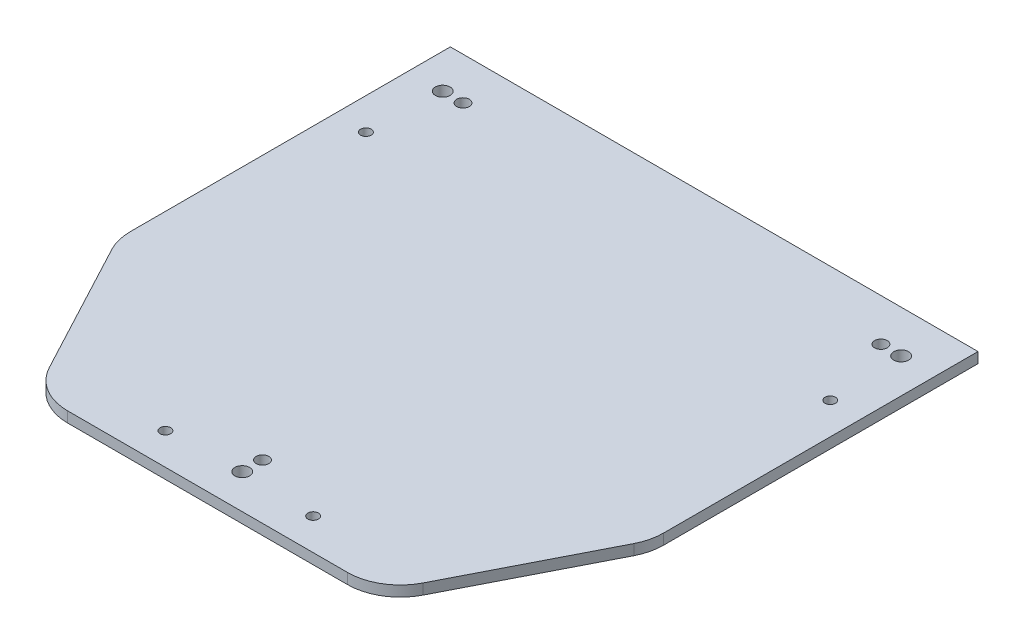
ISO-10303-21;
HEADER;
FILE_DESCRIPTION(('STEP AP214'),'2;1');
FILE_NAME('part.step','',(''),(''),'','','');
FILE_SCHEMA(('AUTOMOTIVE_DESIGN { 1 0 10303 214 1 1 1 1 }'));
ENDSEC;
DATA;
#1=APPLICATION_CONTEXT('core data for automotive mechanical design processes');
#2=APPLICATION_PROTOCOL_DEFINITION('international standard','automotive_design',2000,#1);
#3=PRODUCT_CONTEXT('',#1,'mechanical');
#4=PRODUCT('Part','Part','',(#3));
#5=PRODUCT_RELATED_PRODUCT_CATEGORY('part','',(#4));
#6=PRODUCT_DEFINITION_FORMATION('','',#4);
#7=PRODUCT_DEFINITION_CONTEXT('part definition',#1,'design');
#8=PRODUCT_DEFINITION('design','',#6,#7);
#9=PRODUCT_DEFINITION_SHAPE('','',#8);
#10=(LENGTH_UNIT() NAMED_UNIT(*) SI_UNIT(.MILLI.,.METRE.));
#11=(NAMED_UNIT(*) PLANE_ANGLE_UNIT() SI_UNIT($,.RADIAN.));
#12=(NAMED_UNIT(*) SI_UNIT($,.STERADIAN.) SOLID_ANGLE_UNIT());
#13=UNCERTAINTY_MEASURE_WITH_UNIT(LENGTH_MEASURE(1.E-05),#10,'distance_accuracy_value','');
#14=(GEOMETRIC_REPRESENTATION_CONTEXT(3) GLOBAL_UNCERTAINTY_ASSIGNED_CONTEXT((#13)) GLOBAL_UNIT_ASSIGNED_CONTEXT((#10,
#11,#12)) REPRESENTATION_CONTEXT('',''));
#15=CARTESIAN_POINT('',(0.,0.,0.));
#16=DIRECTION('',(0.,0.,1.));
#17=DIRECTION('',(1.,0.,0.));
#18=AXIS2_PLACEMENT_3D('',#15,#16,#17);
#19=CARTESIAN_POINT('',(536.86150331075,5.,274.278683229091));
#20=DIRECTION('',(-0.890513448018108,0.,-0.454956919827471));
#21=DIRECTION('',(-0.454956919827471,0.,0.890513448018108));
#22=AXIS2_PLACEMENT_3D('',#19,#20,#21);
#23=PLANE('',#22);
#24=DIRECTION('',(0.454956919827471,0.,-0.890513448018108));
#25=VECTOR('',#24,1.);
#26=CARTESIAN_POINT('',(536.86150331075,0.,274.278683229091));
#27=LINE('',#26,#25);
#28=CARTESIAN_POINT('',(624.790123099664,0.,102.170918789785));
#29=VERTEX_POINT('',#28);
#30=CARTESIAN_POINT('',(658.530191598836,0.,36.1295345924439));
#31=VERTEX_POINT('',#30);
#32=EDGE_CURVE('E155',#29,#31,#27,.T.);
#33=ORIENTED_EDGE('',*,*,#32,.T.);
#34=DIRECTION('',(0.,-1.,0.));
#35=VECTOR('',#34,1.);
#36=CARTESIAN_POINT('',(658.530191598836,5.,36.1295345924439));
#37=LINE('',#36,#35);
#38=CARTESIAN_POINT('',(658.530191598836,5.,36.1295345924439));
#39=VERTEX_POINT('',#38);
#40=EDGE_CURVE('E11',#39,#31,#37,.T.);
#41=ORIENTED_EDGE('',*,*,#40,.F.);
#42=DIRECTION('',(0.454956919827471,0.,-0.890513448018108));
#43=VECTOR('',#42,1.);
#44=CARTESIAN_POINT('',(536.86150331075,5.,274.278683229091));
#45=LINE('',#44,#43);
#46=CARTESIAN_POINT('',(624.790123099664,5.,102.170918789785));
#47=VERTEX_POINT('',#46);
#48=EDGE_CURVE('E192',#47,#39,#45,.T.);
#49=ORIENTED_EDGE('',*,*,#48,.F.);
#50=DIRECTION('',(0.,-1.,0.));
#51=VECTOR('',#50,1.);
#52=CARTESIAN_POINT('',(624.790123099664,5.,102.170918789785));
#53=LINE('',#52,#51);
#54=EDGE_CURVE('E58',#47,#29,#53,.T.);
#55=ORIENTED_EDGE('',*,*,#54,.T.);
#56=EDGE_LOOP('',(#33,#41,#49,#55));
#57=FACE_BOUND('',#56,.T.);
#58=ADVANCED_FACE('F41',(#57),#23,.F.);
#59=CARTESIAN_POINT('',(636.267355398383,5.,24.755611596757));
#60=DIRECTION('',(0.,-1.,0.));
#61=DIRECTION('',(0.,0.,-1.));
#62=AXIS2_PLACEMENT_3D('',#59,#60,#61);
#63=CYLINDRICAL_SURFACE('',#62,25.0000000000001);
#64=CARTESIAN_POINT('',(636.267355398383,0.,24.755611596757));
#65=DIRECTION('',(0.,1.,0.));
#66=DIRECTION('',(0.,0.,1.));
#67=AXIS2_PLACEMENT_3D('',#64,#65,#66);
#68=CIRCLE('',#67,25.0000000000001);
#69=CARTESIAN_POINT('',(661.267355398383,0.,24.755611596757));
#70=VERTEX_POINT('',#69);
#71=EDGE_CURVE('E158',#31,#70,#68,.T.);
#72=ORIENTED_EDGE('',*,*,#71,.T.);
#73=DIRECTION('',(0.,-1.,0.));
#74=VECTOR('',#73,1.);
#75=CARTESIAN_POINT('',(661.267355398383,5.,24.755611596757));
#76=LINE('',#75,#74);
#77=CARTESIAN_POINT('',(661.267355398383,5.,24.755611596757));
#78=VERTEX_POINT('',#77);
#79=EDGE_CURVE('E50',#78,#70,#76,.T.);
#80=ORIENTED_EDGE('',*,*,#79,.F.);
#81=CARTESIAN_POINT('',(636.267355398383,5.,24.755611596757));
#82=DIRECTION('',(0.,1.,0.));
#83=DIRECTION('',(0.,0.,1.));
#84=AXIS2_PLACEMENT_3D('',#81,#82,#83);
#85=CIRCLE('',#84,25.0000000000001);
#86=EDGE_CURVE('E102',#39,#78,#85,.T.);
#87=ORIENTED_EDGE('',*,*,#86,.F.);
#88=ORIENTED_EDGE('',*,*,#40,.T.);
#89=EDGE_LOOP('',(#72,#80,#87,#88));
#90=FACE_BOUND('',#89,.T.);
#91=ADVANCED_FACE('F217',(#90),#63,.T.);
#92=CARTESIAN_POINT('',(661.267355398383,5.,0.));
#93=DIRECTION('',(1.,0.,0.));
#94=DIRECTION('',(0.,0.,-1.));
#95=AXIS2_PLACEMENT_3D('',#92,#93,#94);
#96=PLANE('',#95);
#97=DIRECTION('',(0.,0.,1.));
#98=VECTOR('',#97,1.);
#99=CARTESIAN_POINT('',(661.267355398383,0.,0.));
#100=LINE('',#99,#98);
#101=CARTESIAN_POINT('',(661.267355398383,0.,-124.203004205902));
#102=VERTEX_POINT('',#101);
#103=EDGE_CURVE('E163',#102,#70,#100,.T.);
#104=ORIENTED_EDGE('',*,*,#103,.F.);
#105=DIRECTION('',(0.,-1.,0.));
#106=VECTOR('',#105,1.);
#107=CARTESIAN_POINT('',(661.267355398383,5.,-124.203004205902));
#108=LINE('',#107,#106);
#109=CARTESIAN_POINT('',(661.267355398383,5.,-124.203004205902));
#110=VERTEX_POINT('',#109);
#111=EDGE_CURVE('E208',#110,#102,#108,.T.);
#112=ORIENTED_EDGE('',*,*,#111,.F.);
#113=DIRECTION('',(0.,0.,1.));
#114=VECTOR('',#113,1.);
#115=CARTESIAN_POINT('',(661.267355398383,5.,0.));
#116=LINE('',#115,#114);
#117=EDGE_CURVE('E216',#110,#78,#116,.T.);
#118=ORIENTED_EDGE('',*,*,#117,.T.);
#119=ORIENTED_EDGE('',*,*,#79,.T.);
#120=EDGE_LOOP('',(#104,#112,#118,#119));
#121=FACE_BOUND('',#120,.T.);
#122=ADVANCED_FACE('F214',(#121),#96,.T.);
#123=CARTESIAN_POINT('',(0.,5.,-124.203004205902));
#124=DIRECTION('',(0.,0.,-1.));
#125=DIRECTION('',(-1.,0.,0.));
#126=AXIS2_PLACEMENT_3D('',#123,#124,#125);
#127=PLANE('',#126);
#128=DIRECTION('',(1.,0.,0.));
#129=VECTOR('',#128,1.);
#130=CARTESIAN_POINT('',(0.,0.,-124.203004205902));
#131=LINE('',#130,#129);
#132=CARTESIAN_POINT('',(411.267355398383,0.,-124.203004205902));
#133=VERTEX_POINT('',#132);
#134=EDGE_CURVE('E167',#133,#102,#131,.T.);
#135=ORIENTED_EDGE('',*,*,#134,.F.);
#136=DIRECTION('',(0.,-1.,0.));
#137=VECTOR('',#136,1.);
#138=CARTESIAN_POINT('',(411.267355398383,5.,-124.203004205902));
#139=LINE('',#138,#137);
#140=CARTESIAN_POINT('',(411.267355398383,5.,-124.203004205902));
#141=VERTEX_POINT('',#140);
#142=EDGE_CURVE('E205',#141,#133,#139,.T.);
#143=ORIENTED_EDGE('',*,*,#142,.F.);
#144=DIRECTION('',(1.,0.,0.));
#145=VECTOR('',#144,1.);
#146=CARTESIAN_POINT('',(0.,5.,-124.203004205902));
#147=LINE('',#146,#145);
#148=EDGE_CURVE('E228',#141,#110,#147,.T.);
#149=ORIENTED_EDGE('',*,*,#148,.T.);
#150=ORIENTED_EDGE('',*,*,#111,.T.);
#151=EDGE_LOOP('',(#135,#143,#149,#150));
#152=FACE_BOUND('',#151,.T.);
#153=ADVANCED_FACE('F224',(#152),#127,.T.);
#154=CARTESIAN_POINT('',(411.267355398383,5.,0.));
#155=DIRECTION('',(1.,0.,0.));
#156=DIRECTION('',(0.,0.,-1.));
#157=AXIS2_PLACEMENT_3D('',#154,#155,#156);
#158=PLANE('',#157);
#159=DIRECTION('',(0.,0.,1.));
#160=VECTOR('',#159,1.);
#161=CARTESIAN_POINT('',(411.267355398383,0.,0.));
#162=LINE('',#161,#160);
#163=CARTESIAN_POINT('',(411.267355398383,0.,27.3704280435589));
#164=VERTEX_POINT('',#163);
#165=EDGE_CURVE('E171',#133,#164,#162,.T.);
#166=ORIENTED_EDGE('',*,*,#165,.T.);
#167=DIRECTION('',(0.,-1.,0.));
#168=VECTOR('',#167,1.);
#169=CARTESIAN_POINT('',(411.267355398383,5.,27.3704280435589));
#170=LINE('',#169,#168);
#171=CARTESIAN_POINT('',(411.267355398383,5.,27.3704280435589));
#172=VERTEX_POINT('',#171);
#173=EDGE_CURVE('E202',#172,#164,#170,.T.);
#174=ORIENTED_EDGE('',*,*,#173,.F.);
#175=DIRECTION('',(0.,0.,1.));
#176=VECTOR('',#175,1.);
#177=CARTESIAN_POINT('',(411.267355398383,5.,0.));
#178=LINE('',#177,#176);
#179=EDGE_CURVE('E233',#141,#172,#178,.T.);
#180=ORIENTED_EDGE('',*,*,#179,.F.);
#181=ORIENTED_EDGE('',*,*,#142,.T.);
#182=EDGE_LOOP('',(#166,#174,#180,#181));
#183=FACE_BOUND('',#182,.T.);
#184=ADVANCED_FACE('F520',(#183),#158,.F.);
#185=CARTESIAN_POINT('',(436.267355398383,5.,27.370428043559));
#186=DIRECTION('',(0.,-1.,0.));
#187=DIRECTION('',(0.,0.,-1.));
#188=AXIS2_PLACEMENT_3D('',#185,#186,#187);
#189=CYLINDRICAL_SURFACE('',#188,25.);
#190=CARTESIAN_POINT('',(436.267355398383,0.,27.370428043559));
#191=DIRECTION('',(0.,1.,0.));
#192=DIRECTION('',(0.,0.,1.));
#193=AXIS2_PLACEMENT_3D('',#190,#191,#192);
#194=CIRCLE('',#193,25.);
#195=CARTESIAN_POINT('',(414.195911055447,0.,39.1114392698839));
#196=VERTEX_POINT('',#195);
#197=EDGE_CURVE('E175',#196,#164,#194,.F.);
#198=ORIENTED_EDGE('',*,*,#197,.F.);
#199=DIRECTION('',(0.,-1.,0.));
#200=VECTOR('',#199,1.);
#201=CARTESIAN_POINT('',(414.195911055447,5.,39.1114392698839));
#202=LINE('',#201,#200);
#203=CARTESIAN_POINT('',(414.195911055447,5.,39.1114392698839));
#204=VERTEX_POINT('',#203);
#205=EDGE_CURVE('E199',#204,#196,#202,.T.);
#206=ORIENTED_EDGE('',*,*,#205,.F.);
#207=CARTESIAN_POINT('',(436.267355398383,5.,27.370428043559));
#208=DIRECTION('',(0.,1.,0.));
#209=DIRECTION('',(0.,0.,1.));
#210=AXIS2_PLACEMENT_3D('',#207,#208,#209);
#211=CIRCLE('',#210,25.);
#212=EDGE_CURVE('E240',#204,#172,#211,.F.);
#213=ORIENTED_EDGE('',*,*,#212,.T.);
#214=ORIENTED_EDGE('',*,*,#173,.T.);
#215=EDGE_LOOP('',(#198,#206,#213,#214));
#216=FACE_BOUND('',#215,.T.);
#217=ADVANCED_FACE('F512',(#216),#189,.T.);
#218=CARTESIAN_POINT('',(306.623361099184,5.,-163.109775191092));
#219=DIRECTION('',(-0.882857773717434,0.,0.469640449052993));
#220=DIRECTION('',(0.469640449052993,0.,0.882857773717434));
#221=AXIS2_PLACEMENT_3D('',#218,#219,#220);
#222=PLANE('',#221);
#223=DIRECTION('',(-0.469640449052993,0.,-0.882857773717434));
#224=VECTOR('',#223,1.);
#225=CARTESIAN_POINT('',(306.623361099184,0.,-163.109775191092));
#226=LINE('',#225,#224);
#227=CARTESIAN_POINT('',(447.93597955462,0.,102.538007020423));
#228=VERTEX_POINT('',#227);
#229=EDGE_CURVE('E179',#228,#196,#226,.T.);
#230=ORIENTED_EDGE('',*,*,#229,.F.);
#231=DIRECTION('',(0.,-1.,0.));
#232=VECTOR('',#231,1.);
#233=CARTESIAN_POINT('',(447.93597955462,5.,102.538007020423));
#234=LINE('',#233,#232);
#235=CARTESIAN_POINT('',(447.93597955462,5.,102.538007020423));
#236=VERTEX_POINT('',#235);
#237=EDGE_CURVE('E145',#236,#228,#234,.T.);
#238=ORIENTED_EDGE('',*,*,#237,.F.);
#239=DIRECTION('',(-0.469640449052993,0.,-0.882857773717434));
#240=VECTOR('',#239,1.);
#241=CARTESIAN_POINT('',(306.623361099184,5.,-163.109775191092));
#242=LINE('',#241,#240);
#243=EDGE_CURVE('E133',#236,#204,#242,.T.);
#244=ORIENTED_EDGE('',*,*,#243,.T.);
#245=ORIENTED_EDGE('',*,*,#205,.T.);
#246=EDGE_LOOP('',(#230,#238,#244,#245));
#247=FACE_BOUND('',#246,.T.);
#248=ADVANCED_FACE('F246',(#247),#222,.T.);
#249=CARTESIAN_POINT('',(470.007423897556,5.,90.7969957940983));
#250=DIRECTION('',(0.,-1.,0.));
#251=DIRECTION('',(0.,0.,-1.));
#252=AXIS2_PLACEMENT_3D('',#249,#250,#251);
#253=CYLINDRICAL_SURFACE('',#252,25.);
#254=CARTESIAN_POINT('',(470.007423897556,0.,90.7969957940983));
#255=DIRECTION('',(0.,1.,0.));
#256=DIRECTION('',(0.,0.,1.));
#257=AXIS2_PLACEMENT_3D('',#254,#255,#256);
#258=CIRCLE('',#257,25.);
#259=CARTESIAN_POINT('',(470.007423897556,0.,115.796995794098));
#260=VERTEX_POINT('',#259);
#261=EDGE_CURVE('E141',#228,#260,#258,.T.);
#262=ORIENTED_EDGE('',*,*,#261,.T.);
#263=DIRECTION('',(0.,-1.,0.));
#264=VECTOR('',#263,1.);
#265=CARTESIAN_POINT('',(470.007423897556,5.,115.796995794098));
#266=LINE('',#265,#264);
#267=CARTESIAN_POINT('',(470.007423897556,5.,115.796995794098));
#268=VERTEX_POINT('',#267);
#269=EDGE_CURVE('E138',#268,#260,#266,.T.);
#270=ORIENTED_EDGE('',*,*,#269,.F.);
#271=CARTESIAN_POINT('',(470.007423897556,5.,90.7969957940983));
#272=DIRECTION('',(0.,1.,0.));
#273=DIRECTION('',(0.,0.,1.));
#274=AXIS2_PLACEMENT_3D('',#271,#272,#273);
#275=CIRCLE('',#274,25.);
#276=EDGE_CURVE('E125',#236,#268,#275,.T.);
#277=ORIENTED_EDGE('',*,*,#276,.F.);
#278=ORIENTED_EDGE('',*,*,#237,.T.);
#279=EDGE_LOOP('',(#262,#270,#277,#278));
#280=FACE_BOUND('',#279,.T.);
#281=ADVANCED_FACE('F139',(#280),#253,.T.);
#282=CARTESIAN_POINT('',(0.,5.,115.796995794098));
#283=DIRECTION('',(0.,0.,1.));
#284=DIRECTION('',(1.,0.,0.));
#285=AXIS2_PLACEMENT_3D('',#282,#283,#284);
#286=PLANE('',#285);
#287=DIRECTION('',(-1.,0.,0.));
#288=VECTOR('',#287,1.);
#289=CARTESIAN_POINT('',(0.,0.,115.796995794098));
#290=LINE('',#289,#288);
#291=CARTESIAN_POINT('',(602.527286899211,0.,115.796995794098));
#292=VERTEX_POINT('',#291);
#293=EDGE_CURVE('E185',#292,#260,#290,.T.);
#294=ORIENTED_EDGE('',*,*,#293,.F.);
#295=DIRECTION('',(0.,-1.,0.));
#296=VECTOR('',#295,1.);
#297=CARTESIAN_POINT('',(602.527286899211,5.,115.796995794098));
#298=LINE('',#297,#296);
#299=CARTESIAN_POINT('',(602.527286899211,5.,115.796995794098));
#300=VERTEX_POINT('',#299);
#301=EDGE_CURVE('E90',#300,#292,#298,.T.);
#302=ORIENTED_EDGE('',*,*,#301,.F.);
#303=DIRECTION('',(-1.,0.,0.));
#304=VECTOR('',#303,1.);
#305=CARTESIAN_POINT('',(0.,5.,115.796995794098));
#306=LINE('',#305,#304);
#307=EDGE_CURVE('E130',#300,#268,#306,.T.);
#308=ORIENTED_EDGE('',*,*,#307,.T.);
#309=ORIENTED_EDGE('',*,*,#269,.T.);
#310=EDGE_LOOP('',(#294,#302,#308,#309));
#311=FACE_BOUND('',#310,.T.);
#312=ADVANCED_FACE('F147',(#311),#286,.T.);
#313=CARTESIAN_POINT('',(602.527286899211,5.,90.7969957940983));
#314=DIRECTION('',(0.,-1.,0.));
#315=DIRECTION('',(0.,0.,-1.));
#316=AXIS2_PLACEMENT_3D('',#313,#314,#315);
#317=CYLINDRICAL_SURFACE('',#316,25.);
#318=CARTESIAN_POINT('',(602.527286899211,0.,90.7969957940983));
#319=DIRECTION('',(0.,1.,0.));
#320=DIRECTION('',(0.,0.,1.));
#321=AXIS2_PLACEMENT_3D('',#318,#319,#320);
#322=CIRCLE('',#321,25.);
#323=EDGE_CURVE('E188',#29,#292,#322,.F.);
#324=ORIENTED_EDGE('',*,*,#323,.F.);
#325=ORIENTED_EDGE('',*,*,#54,.F.);
#326=CARTESIAN_POINT('',(602.527286899211,5.,90.7969957940983));
#327=DIRECTION('',(0.,1.,0.));
#328=DIRECTION('',(0.,0.,1.));
#329=AXIS2_PLACEMENT_3D('',#326,#327,#328);
#330=CIRCLE('',#329,25.);
#331=EDGE_CURVE('E149',#47,#300,#330,.F.);
#332=ORIENTED_EDGE('',*,*,#331,.T.);
#333=ORIENTED_EDGE('',*,*,#301,.T.);
#334=EDGE_LOOP('',(#324,#325,#332,#333));
#335=FACE_BOUND('',#334,.T.);
#336=ADVANCED_FACE('F248',(#335),#317,.T.);
#337=CARTESIAN_POINT('',(0.,5.,0.));
#338=DIRECTION('',(0.,1.,0.));
#339=DIRECTION('',(0.,0.,1.));
#340=AXIS2_PLACEMENT_3D('',#337,#338,#339);
#341=PLANE('',#340);
#342=CARTESIAN_POINT('',(426.267355398383,5.,-69.2030042059017));
#343=DIRECTION('',(0.,1.,0.));
#344=DIRECTION('',(0.,0.,1.));
#345=AXIS2_PLACEMENT_3D('',#342,#343,#344);
#346=CIRCLE('',#345,2.50000000000002);
#347=CARTESIAN_POINT('',(426.267355398383,5.,-66.7030042059017));
#348=VERTEX_POINT('',#347);
#349=EDGE_CURVE('E314',#348,#348,#346,.T.);
#350=ORIENTED_EDGE('',*,*,#349,.F.);
#351=EDGE_LOOP('',(#350));
#352=FACE_BOUND('',#351,.T.);
#353=CARTESIAN_POINT('',(644.867355398383,5.,-104.203004205902));
#354=DIRECTION('',(0.,1.,0.));
#355=DIRECTION('',(0.,0.,1.));
#356=AXIS2_PLACEMENT_3D('',#353,#354,#355);
#357=CIRCLE('',#356,3.49999999999997);
#358=CARTESIAN_POINT('',(644.867355398383,5.,-100.703004205902));
#359=VERTEX_POINT('',#358);
#360=EDGE_CURVE('E305',#359,#359,#357,.T.);
#361=ORIENTED_EDGE('',*,*,#360,.F.);
#362=EDGE_LOOP('',(#361));
#363=FACE_BOUND('',#362,.T.);
#364=CARTESIAN_POINT('',(635.267355398383,5.,-104.203004205902));
#365=DIRECTION('',(0.,1.,0.));
#366=DIRECTION('',(0.,0.,1.));
#367=AXIS2_PLACEMENT_3D('',#364,#365,#366);
#368=CIRCLE('',#367,3.00000000000005);
#369=CARTESIAN_POINT('',(635.267355398383,5.,-101.203004205902));
#370=VERTEX_POINT('',#369);
#371=EDGE_CURVE('E330',#370,#370,#368,.T.);
#372=ORIENTED_EDGE('',*,*,#371,.F.);
#373=EDGE_LOOP('',(#372));
#374=FACE_BOUND('',#373,.T.);
#375=CARTESIAN_POINT('',(427.667355398383,5.,-104.203004205902));
#376=DIRECTION('',(0.,1.,0.));
#377=DIRECTION('',(0.,0.,1.));
#378=AXIS2_PLACEMENT_3D('',#375,#376,#377);
#379=CIRCLE('',#378,3.50000000000002);
#380=CARTESIAN_POINT('',(427.667355398383,5.,-100.703004205902));
#381=VERTEX_POINT('',#380);
#382=EDGE_CURVE('E321',#381,#381,#379,.T.);
#383=ORIENTED_EDGE('',*,*,#382,.F.);
#384=EDGE_LOOP('',(#383));
#385=FACE_BOUND('',#384,.T.);
#386=CARTESIAN_POINT('',(536.267355398384,5.,89.7969957940983));
#387=DIRECTION('',(0.,1.,0.));
#388=DIRECTION('',(0.,0.,1.));
#389=AXIS2_PLACEMENT_3D('',#386,#387,#388);
#390=CIRCLE('',#389,3.00000000000005);
#391=CARTESIAN_POINT('',(536.267355398384,5.,92.7969957940983));
#392=VERTEX_POINT('',#391);
#393=EDGE_CURVE('E273',#392,#392,#390,.T.);
#394=ORIENTED_EDGE('',*,*,#393,.F.);
#395=EDGE_LOOP('',(#394));
#396=FACE_BOUND('',#395,.T.);
#397=CARTESIAN_POINT('',(646.267355398383,5.,-69.2030042059017));
#398=DIRECTION('',(0.,1.,0.));
#399=DIRECTION('',(0.,0.,1.));
#400=AXIS2_PLACEMENT_3D('',#397,#398,#399);
#401=CIRCLE('',#400,2.50000000000003);
#402=CARTESIAN_POINT('',(646.267355398383,5.,-66.7030042059017));
#403=VERTEX_POINT('',#402);
#404=EDGE_CURVE('E282',#403,#403,#401,.T.);
#405=ORIENTED_EDGE('',*,*,#404,.F.);
#406=EDGE_LOOP('',(#405));
#407=FACE_BOUND('',#406,.T.);
#408=CARTESIAN_POINT('',(501.267355398383,5.,100.796995794098));
#409=DIRECTION('',(0.,1.,0.));
#410=DIRECTION('',(0.,0.,1.));
#411=AXIS2_PLACEMENT_3D('',#408,#409,#410);
#412=CIRCLE('',#411,2.50000000000003);
#413=CARTESIAN_POINT('',(501.267355398383,5.,103.296995794098));
#414=VERTEX_POINT('',#413);
#415=EDGE_CURVE('E290',#414,#414,#412,.T.);
#416=ORIENTED_EDGE('',*,*,#415,.F.);
#417=EDGE_LOOP('',(#416));
#418=FACE_BOUND('',#417,.T.);
#419=CARTESIAN_POINT('',(571.267355398383,5.,100.796995794098));
#420=DIRECTION('',(0.,1.,0.));
#421=DIRECTION('',(0.,0.,1.));
#422=AXIS2_PLACEMENT_3D('',#419,#420,#421);
#423=CIRCLE('',#422,2.49999999999998);
#424=CARTESIAN_POINT('',(571.267355398383,5.,103.296995794098));
#425=VERTEX_POINT('',#424);
#426=EDGE_CURVE('E298',#425,#425,#423,.T.);
#427=ORIENTED_EDGE('',*,*,#426,.F.);
#428=EDGE_LOOP('',(#427));
#429=FACE_BOUND('',#428,.T.);
#430=CARTESIAN_POINT('',(437.267355398383,5.,-104.203004205902));
#431=DIRECTION('',(0.,1.,0.));
#432=DIRECTION('',(0.,0.,1.));
#433=AXIS2_PLACEMENT_3D('',#430,#431,#432);
#434=CIRCLE('',#433,2.99999999999999);
#435=CARTESIAN_POINT('',(437.267355398383,5.,-101.203004205902));
#436=VERTEX_POINT('',#435);
#437=EDGE_CURVE('E337',#436,#436,#434,.T.);
#438=ORIENTED_EDGE('',*,*,#437,.F.);
#439=EDGE_LOOP('',(#438));
#440=FACE_BOUND('',#439,.T.);
#441=CARTESIAN_POINT('',(536.267355398384,5.,99.3969957940983));
#442=DIRECTION('',(0.,1.,0.));
#443=DIRECTION('',(0.,0.,1.));
#444=AXIS2_PLACEMENT_3D('',#441,#442,#443);
#445=CIRCLE('',#444,3.50000000000007);
#446=CARTESIAN_POINT('',(536.267355398384,5.,102.896995794098));
#447=VERTEX_POINT('',#446);
#448=EDGE_CURVE('E265',#447,#447,#445,.T.);
#449=ORIENTED_EDGE('',*,*,#448,.F.);
#450=EDGE_LOOP('',(#449));
#451=FACE_BOUND('',#450,.T.);
#452=ORIENTED_EDGE('',*,*,#48,.T.);
#453=ORIENTED_EDGE('',*,*,#86,.T.);
#454=ORIENTED_EDGE('',*,*,#117,.F.);
#455=ORIENTED_EDGE('',*,*,#148,.F.);
#456=ORIENTED_EDGE('',*,*,#179,.T.);
#457=ORIENTED_EDGE('',*,*,#212,.F.);
#458=ORIENTED_EDGE('',*,*,#243,.F.);
#459=ORIENTED_EDGE('',*,*,#276,.T.);
#460=ORIENTED_EDGE('',*,*,#307,.F.);
#461=ORIENTED_EDGE('',*,*,#331,.F.);
#462=EDGE_LOOP('',(#452,#453,#454,#455,#456,#457,#458,#459,#460,#461));
#463=FACE_BOUND('',#462,.T.);
#464=ADVANCED_FACE('F127',(#352,#363,#374,#385,#396,#407,#418,#429,#440,#451,#463),#341,.T.);
#465=CARTESIAN_POINT('',(0.,0.,0.));
#466=DIRECTION('',(0.,1.,0.));
#467=DIRECTION('',(0.,0.,1.));
#468=AXIS2_PLACEMENT_3D('',#465,#466,#467);
#469=PLANE('',#468);
#470=CARTESIAN_POINT('',(426.267355398383,0.,-69.2030042059017));
#471=DIRECTION('',(0.,1.,0.));
#472=DIRECTION('',(0.,0.,1.));
#473=AXIS2_PLACEMENT_3D('',#470,#471,#472);
#474=CIRCLE('',#473,2.50000000000002);
#475=CARTESIAN_POINT('',(426.267355398383,0.,-66.7030042059017));
#476=VERTEX_POINT('',#475);
#477=EDGE_CURVE('E278',#476,#476,#474,.T.);
#478=ORIENTED_EDGE('',*,*,#477,.T.);
#479=EDGE_LOOP('',(#478));
#480=FACE_BOUND('',#479,.T.);
#481=CARTESIAN_POINT('',(644.867355398383,0.,-104.203004205902));
#482=DIRECTION('',(0.,1.,0.));
#483=DIRECTION('',(0.,0.,1.));
#484=AXIS2_PLACEMENT_3D('',#481,#482,#483);
#485=CIRCLE('',#484,3.49999999999997);
#486=CARTESIAN_POINT('',(644.867355398383,0.,-100.703004205902));
#487=VERTEX_POINT('',#486);
#488=EDGE_CURVE('E309',#487,#487,#485,.T.);
#489=ORIENTED_EDGE('',*,*,#488,.T.);
#490=EDGE_LOOP('',(#489));
#491=FACE_BOUND('',#490,.T.);
#492=CARTESIAN_POINT('',(635.267355398383,0.,-104.203004205902));
#493=DIRECTION('',(0.,1.,0.));
#494=DIRECTION('',(0.,0.,1.));
#495=AXIS2_PLACEMENT_3D('',#492,#493,#494);
#496=CIRCLE('',#495,3.00000000000005);
#497=CARTESIAN_POINT('',(635.267355398383,0.,-101.203004205902));
#498=VERTEX_POINT('',#497);
#499=EDGE_CURVE('E310',#498,#498,#496,.T.);
#500=ORIENTED_EDGE('',*,*,#499,.T.);
#501=EDGE_LOOP('',(#500));
#502=FACE_BOUND('',#501,.T.);
#503=CARTESIAN_POINT('',(427.667355398383,0.,-104.203004205902));
#504=DIRECTION('',(0.,1.,0.));
#505=DIRECTION('',(0.,0.,1.));
#506=AXIS2_PLACEMENT_3D('',#503,#504,#505);
#507=CIRCLE('',#506,3.50000000000002);
#508=CARTESIAN_POINT('',(427.667355398383,0.,-100.703004205902));
#509=VERTEX_POINT('',#508);
#510=EDGE_CURVE('E325',#509,#509,#507,.T.);
#511=ORIENTED_EDGE('',*,*,#510,.T.);
#512=EDGE_LOOP('',(#511));
#513=FACE_BOUND('',#512,.T.);
#514=CARTESIAN_POINT('',(536.267355398384,0.,89.7969957940983));
#515=DIRECTION('',(0.,1.,0.));
#516=DIRECTION('',(0.,0.,1.));
#517=AXIS2_PLACEMENT_3D('',#514,#515,#516);
#518=CIRCLE('',#517,3.00000000000005);
#519=CARTESIAN_POINT('',(536.267355398384,0.,92.7969957940983));
#520=VERTEX_POINT('',#519);
#521=EDGE_CURVE('E277',#520,#520,#518,.T.);
#522=ORIENTED_EDGE('',*,*,#521,.T.);
#523=EDGE_LOOP('',(#522));
#524=FACE_BOUND('',#523,.T.);
#525=CARTESIAN_POINT('',(646.267355398383,0.,-69.2030042059017));
#526=DIRECTION('',(0.,1.,0.));
#527=DIRECTION('',(0.,0.,1.));
#528=AXIS2_PLACEMENT_3D('',#525,#526,#527);
#529=CIRCLE('',#528,2.50000000000003);
#530=CARTESIAN_POINT('',(646.267355398383,0.,-66.7030042059017));
#531=VERTEX_POINT('',#530);
#532=EDGE_CURVE('E286',#531,#531,#529,.T.);
#533=ORIENTED_EDGE('',*,*,#532,.T.);
#534=EDGE_LOOP('',(#533));
#535=FACE_BOUND('',#534,.T.);
#536=CARTESIAN_POINT('',(501.267355398383,0.,100.796995794098));
#537=DIRECTION('',(0.,1.,0.));
#538=DIRECTION('',(0.,0.,1.));
#539=AXIS2_PLACEMENT_3D('',#536,#537,#538);
#540=CIRCLE('',#539,2.50000000000003);
#541=CARTESIAN_POINT('',(501.267355398383,0.,103.296995794098));
#542=VERTEX_POINT('',#541);
#543=EDGE_CURVE('E294',#542,#542,#540,.T.);
#544=ORIENTED_EDGE('',*,*,#543,.T.);
#545=EDGE_LOOP('',(#544));
#546=FACE_BOUND('',#545,.T.);
#547=CARTESIAN_POINT('',(571.267355398383,0.,100.796995794098));
#548=DIRECTION('',(0.,1.,0.));
#549=DIRECTION('',(0.,0.,1.));
#550=AXIS2_PLACEMENT_3D('',#547,#548,#549);
#551=CIRCLE('',#550,2.49999999999998);
#552=CARTESIAN_POINT('',(571.267355398383,0.,103.296995794098));
#553=VERTEX_POINT('',#552);
#554=EDGE_CURVE('E269',#553,#553,#551,.T.);
#555=ORIENTED_EDGE('',*,*,#554,.T.);
#556=EDGE_LOOP('',(#555));
#557=FACE_BOUND('',#556,.T.);
#558=CARTESIAN_POINT('',(437.267355398383,0.,-104.203004205902));
#559=DIRECTION('',(0.,1.,0.));
#560=DIRECTION('',(0.,0.,1.));
#561=AXIS2_PLACEMENT_3D('',#558,#559,#560);
#562=CIRCLE('',#561,2.99999999999999);
#563=CARTESIAN_POINT('',(437.267355398383,0.,-101.203004205902));
#564=VERTEX_POINT('',#563);
#565=EDGE_CURVE('E326',#564,#564,#562,.T.);
#566=ORIENTED_EDGE('',*,*,#565,.T.);
#567=EDGE_LOOP('',(#566));
#568=FACE_BOUND('',#567,.T.);
#569=CARTESIAN_POINT('',(536.267355398384,0.,99.3969957940983));
#570=DIRECTION('',(0.,1.,0.));
#571=DIRECTION('',(0.,0.,1.));
#572=AXIS2_PLACEMENT_3D('',#569,#570,#571);
#573=CIRCLE('',#572,3.50000000000007);
#574=CARTESIAN_POINT('',(536.267355398384,0.,102.896995794098));
#575=VERTEX_POINT('',#574);
#576=EDGE_CURVE('E159',#575,#575,#573,.T.);
#577=ORIENTED_EDGE('',*,*,#576,.T.);
#578=EDGE_LOOP('',(#577));
#579=FACE_BOUND('',#578,.T.);
#580=ORIENTED_EDGE('',*,*,#32,.F.);
#581=ORIENTED_EDGE('',*,*,#323,.T.);
#582=ORIENTED_EDGE('',*,*,#293,.T.);
#583=ORIENTED_EDGE('',*,*,#261,.F.);
#584=ORIENTED_EDGE('',*,*,#229,.T.);
#585=ORIENTED_EDGE('',*,*,#197,.T.);
#586=ORIENTED_EDGE('',*,*,#165,.F.);
#587=ORIENTED_EDGE('',*,*,#134,.T.);
#588=ORIENTED_EDGE('',*,*,#103,.T.);
#589=ORIENTED_EDGE('',*,*,#71,.F.);
#590=EDGE_LOOP('',(#580,#581,#582,#583,#584,#585,#586,#587,#588,#589));
#591=FACE_BOUND('',#590,.T.);
#592=ADVANCED_FACE('F220',(#480,#491,#502,#513,#524,#535,#546,#557,#568,#579,#591),#469,.F.);
#593=CARTESIAN_POINT('',(536.267355398384,0.,99.3969957940983));
#594=DIRECTION('',(0.,1.,0.));
#595=DIRECTION('',(0.,0.,1.));
#596=AXIS2_PLACEMENT_3D('',#593,#594,#595);
#597=CYLINDRICAL_SURFACE('',#596,3.50000000000007);
#598=ORIENTED_EDGE('',*,*,#576,.F.);
#599=EDGE_LOOP('',(#598));
#600=FACE_BOUND('',#599,.T.);
#601=ORIENTED_EDGE('',*,*,#448,.T.);
#602=EDGE_LOOP('',(#601));
#603=FACE_BOUND('',#602,.T.);
#604=ADVANCED_FACE('F351',(#600,#603),#597,.F.);
#605=CARTESIAN_POINT('',(437.267355398383,0.,-104.203004205902));
#606=DIRECTION('',(0.,1.,0.));
#607=DIRECTION('',(0.,0.,1.));
#608=AXIS2_PLACEMENT_3D('',#605,#606,#607);
#609=CYLINDRICAL_SURFACE('',#608,2.99999999999999);
#610=ORIENTED_EDGE('',*,*,#565,.F.);
#611=EDGE_LOOP('',(#610));
#612=FACE_BOUND('',#611,.T.);
#613=ORIENTED_EDGE('',*,*,#437,.T.);
#614=EDGE_LOOP('',(#613));
#615=FACE_BOUND('',#614,.T.);
#616=ADVANCED_FACE('F347',(#612,#615),#609,.F.);
#617=CARTESIAN_POINT('',(571.267355398383,0.,100.796995794098));
#618=DIRECTION('',(0.,1.,0.));
#619=DIRECTION('',(0.,0.,1.));
#620=AXIS2_PLACEMENT_3D('',#617,#618,#619);
#621=CYLINDRICAL_SURFACE('',#620,2.49999999999998);
#622=ORIENTED_EDGE('',*,*,#554,.F.);
#623=EDGE_LOOP('',(#622));
#624=FACE_BOUND('',#623,.T.);
#625=ORIENTED_EDGE('',*,*,#426,.T.);
#626=EDGE_LOOP('',(#625));
#627=FACE_BOUND('',#626,.T.);
#628=ADVANCED_FACE('F350',(#624,#627),#621,.F.);
#629=CARTESIAN_POINT('',(501.267355398383,0.,100.796995794098));
#630=DIRECTION('',(0.,1.,0.));
#631=DIRECTION('',(0.,0.,1.));
#632=AXIS2_PLACEMENT_3D('',#629,#630,#631);
#633=CYLINDRICAL_SURFACE('',#632,2.50000000000003);
#634=ORIENTED_EDGE('',*,*,#543,.F.);
#635=EDGE_LOOP('',(#634));
#636=FACE_BOUND('',#635,.T.);
#637=ORIENTED_EDGE('',*,*,#415,.T.);
#638=EDGE_LOOP('',(#637));
#639=FACE_BOUND('',#638,.T.);
#640=ADVANCED_FACE('F375',(#636,#639),#633,.F.);
#641=CARTESIAN_POINT('',(646.267355398383,0.,-69.2030042059017));
#642=DIRECTION('',(0.,1.,0.));
#643=DIRECTION('',(0.,0.,1.));
#644=AXIS2_PLACEMENT_3D('',#641,#642,#643);
#645=CYLINDRICAL_SURFACE('',#644,2.50000000000003);
#646=ORIENTED_EDGE('',*,*,#532,.F.);
#647=EDGE_LOOP('',(#646));
#648=FACE_BOUND('',#647,.T.);
#649=ORIENTED_EDGE('',*,*,#404,.T.);
#650=EDGE_LOOP('',(#649));
#651=FACE_BOUND('',#650,.T.);
#652=ADVANCED_FACE('F371',(#648,#651),#645,.F.);
#653=CARTESIAN_POINT('',(536.267355398384,0.,89.7969957940983));
#654=DIRECTION('',(0.,1.,0.));
#655=DIRECTION('',(0.,0.,1.));
#656=AXIS2_PLACEMENT_3D('',#653,#654,#655);
#657=CYLINDRICAL_SURFACE('',#656,3.00000000000005);
#658=ORIENTED_EDGE('',*,*,#521,.F.);
#659=EDGE_LOOP('',(#658));
#660=FACE_BOUND('',#659,.T.);
#661=ORIENTED_EDGE('',*,*,#393,.T.);
#662=EDGE_LOOP('',(#661));
#663=FACE_BOUND('',#662,.T.);
#664=ADVANCED_FACE('F367',(#660,#663),#657,.F.);
#665=CARTESIAN_POINT('',(427.667355398383,0.,-104.203004205902));
#666=DIRECTION('',(0.,1.,0.));
#667=DIRECTION('',(0.,0.,1.));
#668=AXIS2_PLACEMENT_3D('',#665,#666,#667);
#669=CYLINDRICAL_SURFACE('',#668,3.50000000000002);
#670=ORIENTED_EDGE('',*,*,#510,.F.);
#671=EDGE_LOOP('',(#670));
#672=FACE_BOUND('',#671,.T.);
#673=ORIENTED_EDGE('',*,*,#382,.T.);
#674=EDGE_LOOP('',(#673));
#675=FACE_BOUND('',#674,.T.);
#676=ADVANCED_FACE('F370',(#672,#675),#669,.F.);
#677=CARTESIAN_POINT('',(635.267355398383,0.,-104.203004205902));
#678=DIRECTION('',(0.,1.,0.));
#679=DIRECTION('',(0.,0.,1.));
#680=AXIS2_PLACEMENT_3D('',#677,#678,#679);
#681=CYLINDRICAL_SURFACE('',#680,3.00000000000005);
#682=ORIENTED_EDGE('',*,*,#499,.F.);
#683=EDGE_LOOP('',(#682));
#684=FACE_BOUND('',#683,.T.);
#685=ORIENTED_EDGE('',*,*,#371,.T.);
#686=EDGE_LOOP('',(#685));
#687=FACE_BOUND('',#686,.T.);
#688=ADVANCED_FACE('F387',(#684,#687),#681,.F.);
#689=CARTESIAN_POINT('',(644.867355398383,0.,-104.203004205902));
#690=DIRECTION('',(0.,1.,0.));
#691=DIRECTION('',(0.,0.,1.));
#692=AXIS2_PLACEMENT_3D('',#689,#690,#691);
#693=CYLINDRICAL_SURFACE('',#692,3.49999999999997);
#694=ORIENTED_EDGE('',*,*,#488,.F.);
#695=EDGE_LOOP('',(#694));
#696=FACE_BOUND('',#695,.T.);
#697=ORIENTED_EDGE('',*,*,#360,.T.);
#698=EDGE_LOOP('',(#697));
#699=FACE_BOUND('',#698,.T.);
#700=ADVANCED_FACE('F383',(#696,#699),#693,.F.);
#701=CARTESIAN_POINT('',(426.267355398383,0.,-69.2030042059017));
#702=DIRECTION('',(0.,1.,0.));
#703=DIRECTION('',(0.,0.,1.));
#704=AXIS2_PLACEMENT_3D('',#701,#702,#703);
#705=CYLINDRICAL_SURFACE('',#704,2.50000000000002);
#706=ORIENTED_EDGE('',*,*,#477,.F.);
#707=EDGE_LOOP('',(#706));
#708=FACE_BOUND('',#707,.T.);
#709=ORIENTED_EDGE('',*,*,#349,.T.);
#710=EDGE_LOOP('',(#709));
#711=FACE_BOUND('',#710,.T.);
#712=ADVANCED_FACE('F386',(#708,#711),#705,.F.);
#713=CLOSED_SHELL('',(#58,#91,#122,#153,#184,#217,#248,#281,#312,#336,#464,#592,#604,#616,#628,
#640,#652,#664,#676,#688,#700,#712));
#714=MANIFOLD_SOLID_BREP('B2',#713);
#715=ADVANCED_BREP_SHAPE_REPRESENTATION('',(#18,#714),#14);
#716=SHAPE_DEFINITION_REPRESENTATION(#9,#715);
ENDSEC;
END-ISO-10303-21;
